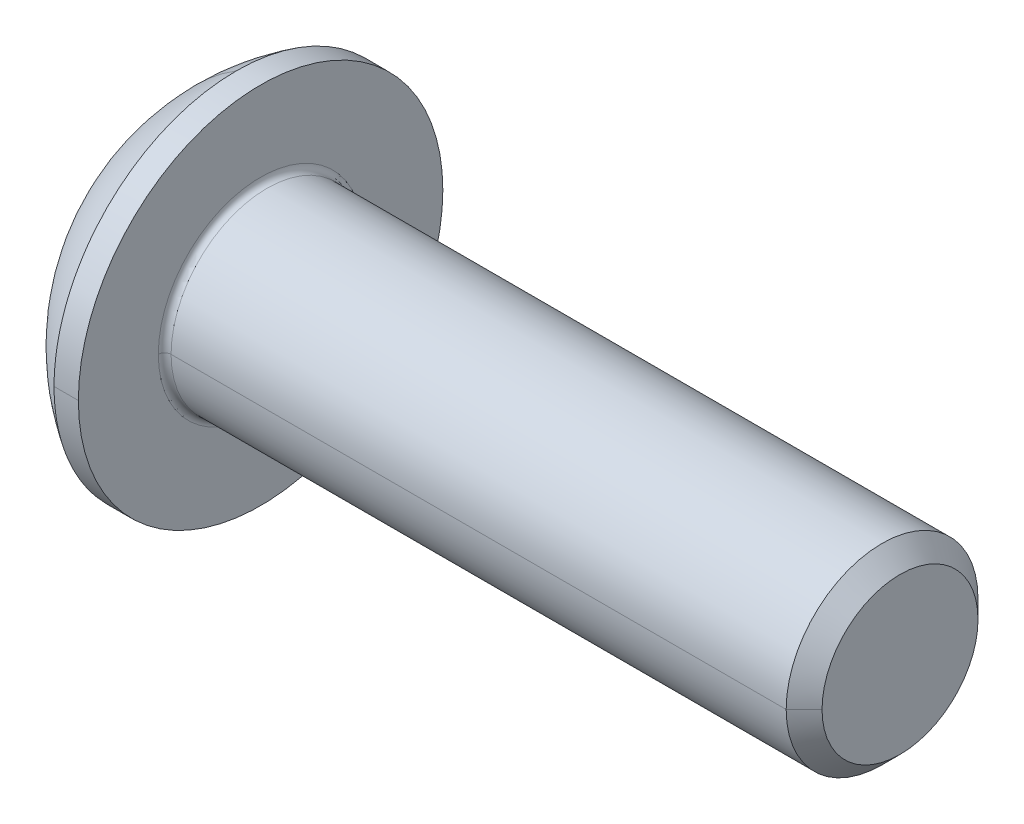
ISO-10303-21;
HEADER;
FILE_DESCRIPTION(('STEP AP214'),'2;1');
FILE_NAME('part.step','',(''),(''),'','','');
FILE_SCHEMA(('AUTOMOTIVE_DESIGN { 1 0 10303 214 1 1 1 1 }'));
ENDSEC;
DATA;
#1=APPLICATION_CONTEXT('core data for automotive mechanical design processes');
#2=APPLICATION_PROTOCOL_DEFINITION('international standard','automotive_design',2000,#1);
#3=PRODUCT_CONTEXT('',#1,'mechanical');
#4=PRODUCT('Part','Part','',(#3));
#5=PRODUCT_RELATED_PRODUCT_CATEGORY('part','',(#4));
#6=PRODUCT_DEFINITION_FORMATION('','',#4);
#7=PRODUCT_DEFINITION_CONTEXT('part definition',#1,'design');
#8=PRODUCT_DEFINITION('design','',#6,#7);
#9=PRODUCT_DEFINITION_SHAPE('','',#8);
#10=(LENGTH_UNIT() NAMED_UNIT(*) SI_UNIT(.MILLI.,.METRE.));
#11=(NAMED_UNIT(*) PLANE_ANGLE_UNIT() SI_UNIT($,.RADIAN.));
#12=(NAMED_UNIT(*) SI_UNIT($,.STERADIAN.) SOLID_ANGLE_UNIT());
#13=UNCERTAINTY_MEASURE_WITH_UNIT(LENGTH_MEASURE(1.E-05),#10,'distance_accuracy_value','');
#14=(GEOMETRIC_REPRESENTATION_CONTEXT(3) GLOBAL_UNCERTAINTY_ASSIGNED_CONTEXT((#13)) GLOBAL_UNIT_ASSIGNED_CONTEXT((#10,
#11,#12)) REPRESENTATION_CONTEXT('',''));
#15=CARTESIAN_POINT('',(0.,0.,0.));
#16=DIRECTION('',(0.,0.,1.));
#17=DIRECTION('',(1.,0.,0.));
#18=AXIS2_PLACEMENT_3D('',#15,#16,#17);
#19=CARTESIAN_POINT('',(-998.38264973081,0.,0.));
#20=DIRECTION('',(-1.,0.,0.));
#21=DIRECTION('',(0.,0.,1.));
#22=AXIS2_PLACEMENT_3D('',#19,#20,#21);
#23=CONICAL_SURFACE('',#22,1732.05080756885,1.0471975511966);
#24=DIRECTION('',(-0.5,0.,-0.866025403784436));
#25=VECTOR('',#24,1.);
#26=CARTESIAN_POINT('',(1.61735026918964,0.,0.));
#27=LINE('',#26,#25);
#28=CARTESIAN_POINT('',(1.61735026918964,0.,0.));
#29=VERTEX_POINT('',#28);
#30=CARTESIAN_POINT('',(1.04,0.,-1.));
#31=VERTEX_POINT('',#30);
#32=EDGE_CURVE('E832',#29,#31,#27,.T.);
#33=ORIENTED_EDGE('',*,*,#32,.F.);
#34=DIRECTION('',(-0.5,0.,0.866025403784436));
#35=VECTOR('',#34,1.);
#36=CARTESIAN_POINT('',(1.61735026918964,0.,0.));
#37=LINE('',#36,#35);
#38=CARTESIAN_POINT('',(1.04,0.,1.));
#39=VERTEX_POINT('',#38);
#40=EDGE_CURVE('E829',#29,#39,#37,.T.);
#41=ORIENTED_EDGE('',*,*,#40,.T.);
#42=CARTESIAN_POINT('',(1.04,0.,0.));
#43=DIRECTION('',(-1.,0.,0.));
#44=DIRECTION('',(0.,0.,1.));
#45=AXIS2_PLACEMENT_3D('',#42,#43,#44);
#46=CIRCLE('',#45,1.);
#47=CARTESIAN_POINT('',(1.04,0.86602540378444,0.5));
#48=VERTEX_POINT('',#47);
#49=EDGE_CURVE('E11',#39,#48,#46,.T.);
#50=ORIENTED_EDGE('',*,*,#49,.T.);
#51=CARTESIAN_POINT('',(1.04,0.,0.));
#52=DIRECTION('',(-1.,0.,0.));
#53=DIRECTION('',(0.,0.,1.));
#54=AXIS2_PLACEMENT_3D('',#51,#52,#53);
#55=CIRCLE('',#54,1.);
#56=CARTESIAN_POINT('',(1.04,0.86602540378444,-0.5));
#57=VERTEX_POINT('',#56);
#58=EDGE_CURVE('E20',#48,#57,#55,.T.);
#59=ORIENTED_EDGE('',*,*,#58,.T.);
#60=CARTESIAN_POINT('',(1.04,0.,0.));
#61=DIRECTION('',(-1.,0.,0.));
#62=DIRECTION('',(0.,0.,1.));
#63=AXIS2_PLACEMENT_3D('',#60,#61,#62);
#64=CIRCLE('',#63,1.);
#65=EDGE_CURVE('E186',#57,#31,#64,.T.);
#66=ORIENTED_EDGE('',*,*,#65,.T.);
#67=EDGE_LOOP('',(#33,#41,#50,#59,#66));
#68=FACE_BOUND('',#67,.T.);
#69=ADVANCED_FACE('F17',(#68),#23,.F.);
#70=CARTESIAN_POINT('',(1.04,-1.73205080756887,-1.));
#71=DIRECTION('',(1.,0.,0.));
#72=DIRECTION('',(0.,1.,0.));
#73=AXIS2_PLACEMENT_3D('',#70,#71,#72);
#74=PLANE('',#73);
#75=CARTESIAN_POINT('',(1.04,0.,0.));
#76=DIRECTION('',(-1.,0.,0.));
#77=DIRECTION('',(0.,0.,1.));
#78=AXIS2_PLACEMENT_3D('',#75,#76,#77);
#79=CIRCLE('',#78,1.);
#80=CARTESIAN_POINT('',(1.04,-0.86602540378444,-0.5));
#81=VERTEX_POINT('',#80);
#82=EDGE_CURVE('E840',#31,#81,#79,.T.);
#83=ORIENTED_EDGE('',*,*,#82,.F.);
#84=DIRECTION('',(0.,1.,0.));
#85=VECTOR('',#84,1.);
#86=CARTESIAN_POINT('',(1.04,0.577350269189628,-1.));
#87=LINE('',#86,#85);
#88=CARTESIAN_POINT('',(1.04,-0.577350269189626,-1.));
#89=VERTEX_POINT('',#88);
#90=EDGE_CURVE('E785',#89,#31,#87,.T.);
#91=ORIENTED_EDGE('',*,*,#90,.F.);
#92=DIRECTION('',(0.,0.5,-0.86602540378444));
#93=VECTOR('',#92,1.);
#94=CARTESIAN_POINT('',(1.04,-0.577350269189626,-1.));
#95=LINE('',#94,#93);
#96=EDGE_CURVE('E788',#81,#89,#95,.T.);
#97=ORIENTED_EDGE('',*,*,#96,.F.);
#98=EDGE_LOOP('',(#83,#91,#97));
#99=FACE_BOUND('',#98,.T.);
#100=ADVANCED_FACE('F441',(#99),#74,.F.);
#101=CARTESIAN_POINT('',(1.04,-1.73205080756887,-1.));
#102=DIRECTION('',(1.,0.,0.));
#103=DIRECTION('',(0.,1.,0.));
#104=AXIS2_PLACEMENT_3D('',#101,#102,#103);
#105=PLANE('',#104);
#106=CARTESIAN_POINT('',(1.04,0.,0.));
#107=DIRECTION('',(-1.,0.,0.));
#108=DIRECTION('',(0.,0.,1.));
#109=AXIS2_PLACEMENT_3D('',#106,#107,#108);
#110=CIRCLE('',#109,1.);
#111=CARTESIAN_POINT('',(1.04,-0.866025403784437,0.5));
#112=VERTEX_POINT('',#111);
#113=EDGE_CURVE('E684',#81,#112,#110,.T.);
#114=ORIENTED_EDGE('',*,*,#113,.F.);
#115=DIRECTION('',(0.,0.5,-0.86602540378444));
#116=VECTOR('',#115,1.);
#117=CARTESIAN_POINT('',(1.04,-0.577350269189626,-1.));
#118=LINE('',#117,#116);
#119=CARTESIAN_POINT('',(1.04,-1.15470053837925,0.));
#120=VERTEX_POINT('',#119);
#121=EDGE_CURVE('E793',#120,#81,#118,.T.);
#122=ORIENTED_EDGE('',*,*,#121,.F.);
#123=DIRECTION('',(0.,-0.5,-0.866025403784439));
#124=VECTOR('',#123,1.);
#125=CARTESIAN_POINT('',(1.04,-1.15470053837925,0.));
#126=LINE('',#125,#124);
#127=EDGE_CURVE('E798',#112,#120,#126,.T.);
#128=ORIENTED_EDGE('',*,*,#127,.F.);
#129=EDGE_LOOP('',(#114,#122,#128));
#130=FACE_BOUND('',#129,.T.);
#131=ADVANCED_FACE('F431',(#130),#105,.F.);
#132=CARTESIAN_POINT('',(1.04,-1.73205080756887,-1.));
#133=DIRECTION('',(1.,0.,0.));
#134=DIRECTION('',(0.,1.,0.));
#135=AXIS2_PLACEMENT_3D('',#132,#133,#134);
#136=PLANE('',#135);
#137=CARTESIAN_POINT('',(1.04,0.,0.));
#138=DIRECTION('',(-1.,0.,0.));
#139=DIRECTION('',(0.,0.,1.));
#140=AXIS2_PLACEMENT_3D('',#137,#138,#139);
#141=CIRCLE('',#140,1.);
#142=EDGE_CURVE('E676',#112,#39,#141,.T.);
#143=ORIENTED_EDGE('',*,*,#142,.F.);
#144=DIRECTION('',(0.,-0.5,-0.866025403784439));
#145=VECTOR('',#144,1.);
#146=CARTESIAN_POINT('',(1.04,-1.15470053837925,0.));
#147=LINE('',#146,#145);
#148=CARTESIAN_POINT('',(1.04,-0.577350269189625,1.));
#149=VERTEX_POINT('',#148);
#150=EDGE_CURVE('E794',#149,#112,#147,.T.);
#151=ORIENTED_EDGE('',*,*,#150,.F.);
#152=DIRECTION('',(0.,-1.,0.));
#153=VECTOR('',#152,1.);
#154=CARTESIAN_POINT('',(1.04,-0.577350269189625,1.));
#155=LINE('',#154,#153);
#156=EDGE_CURVE('E184',#39,#149,#155,.T.);
#157=ORIENTED_EDGE('',*,*,#156,.F.);
#158=EDGE_LOOP('',(#143,#151,#157));
#159=FACE_BOUND('',#158,.T.);
#160=ADVANCED_FACE('F422',(#159),#136,.F.);
#161=CARTESIAN_POINT('',(1.04,-1.73205080756887,-1.));
#162=DIRECTION('',(1.,0.,0.));
#163=DIRECTION('',(0.,1.,0.));
#164=AXIS2_PLACEMENT_3D('',#161,#162,#163);
#165=PLANE('',#164);
#166=ORIENTED_EDGE('',*,*,#49,.F.);
#167=DIRECTION('',(0.,-1.,0.));
#168=VECTOR('',#167,1.);
#169=CARTESIAN_POINT('',(1.04,-0.577350269189625,1.));
#170=LINE('',#169,#168);
#171=CARTESIAN_POINT('',(1.04,0.577350269189628,1.));
#172=VERTEX_POINT('',#171);
#173=EDGE_CURVE('E41',#172,#39,#170,.T.);
#174=ORIENTED_EDGE('',*,*,#173,.F.);
#175=DIRECTION('',(0.,-0.5,0.86602540378444));
#176=VECTOR('',#175,1.);
#177=CARTESIAN_POINT('',(1.04,0.577350269189628,1.));
#178=LINE('',#177,#176);
#179=EDGE_CURVE('E157',#48,#172,#178,.T.);
#180=ORIENTED_EDGE('',*,*,#179,.F.);
#181=EDGE_LOOP('',(#166,#174,#180));
#182=FACE_BOUND('',#181,.T.);
#183=ADVANCED_FACE('F413',(#182),#165,.F.);
#184=CARTESIAN_POINT('',(1.04,-1.73205080756887,-1.));
#185=DIRECTION('',(1.,0.,0.));
#186=DIRECTION('',(0.,1.,0.));
#187=AXIS2_PLACEMENT_3D('',#184,#185,#186);
#188=PLANE('',#187);
#189=ORIENTED_EDGE('',*,*,#58,.F.);
#190=DIRECTION('',(0.,-0.5,0.86602540378444));
#191=VECTOR('',#190,1.);
#192=CARTESIAN_POINT('',(1.04,0.577350269189628,1.));
#193=LINE('',#192,#191);
#194=CARTESIAN_POINT('',(1.04,1.15470053837925,0.));
#195=VERTEX_POINT('',#194);
#196=EDGE_CURVE('E148',#195,#48,#193,.T.);
#197=ORIENTED_EDGE('',*,*,#196,.F.);
#198=DIRECTION('',(0.,0.5,0.86602540378444));
#199=VECTOR('',#198,1.);
#200=CARTESIAN_POINT('',(1.04,1.15470053837925,0.));
#201=LINE('',#200,#199);
#202=EDGE_CURVE('E152',#57,#195,#201,.T.);
#203=ORIENTED_EDGE('',*,*,#202,.F.);
#204=EDGE_LOOP('',(#189,#197,#203));
#205=FACE_BOUND('',#204,.T.);
#206=ADVANCED_FACE('F150',(#205),#188,.F.);
#207=CARTESIAN_POINT('',(1.04,-1.73205080756887,-1.));
#208=DIRECTION('',(1.,0.,0.));
#209=DIRECTION('',(0.,1.,0.));
#210=AXIS2_PLACEMENT_3D('',#207,#208,#209);
#211=PLANE('',#210);
#212=ORIENTED_EDGE('',*,*,#65,.F.);
#213=DIRECTION('',(0.,0.5,0.86602540378444));
#214=VECTOR('',#213,1.);
#215=CARTESIAN_POINT('',(1.04,1.15470053837925,0.));
#216=LINE('',#215,#214);
#217=CARTESIAN_POINT('',(1.04,0.577350269189628,-1.));
#218=VERTEX_POINT('',#217);
#219=EDGE_CURVE('E171',#218,#57,#216,.T.);
#220=ORIENTED_EDGE('',*,*,#219,.F.);
#221=DIRECTION('',(0.,1.,0.));
#222=VECTOR('',#221,1.);
#223=CARTESIAN_POINT('',(1.04,0.577350269189628,-1.));
#224=LINE('',#223,#222);
#225=EDGE_CURVE('E781',#31,#218,#224,.T.);
#226=ORIENTED_EDGE('',*,*,#225,.F.);
#227=EDGE_LOOP('',(#212,#220,#226));
#228=FACE_BOUND('',#227,.T.);
#229=ADVANCED_FACE('F267',(#228),#211,.F.);
#230=CARTESIAN_POINT('',(1.04,-0.577350269189625,1.));
#231=DIRECTION('',(0.,0.,-1.));
#232=DIRECTION('',(-1.,0.,0.));
#233=AXIS2_PLACEMENT_3D('',#230,#231,#232);
#234=PLANE('',#233);
#235=ORIENTED_EDGE('',*,*,#173,.T.);
#236=ORIENTED_EDGE('',*,*,#156,.T.);
#237=DIRECTION('',(-1.,0.,0.));
#238=VECTOR('',#237,1.);
#239=CARTESIAN_POINT('',(1.04,-0.577350269189625,1.));
#240=LINE('',#239,#238);
#241=CARTESIAN_POINT('',(0.,-0.577350269189625,1.));
#242=VERTEX_POINT('',#241);
#243=EDGE_CURVE('E807',#149,#242,#240,.T.);
#244=ORIENTED_EDGE('',*,*,#243,.T.);
#245=DIRECTION('',(0.,-1.,0.));
#246=VECTOR('',#245,1.);
#247=CARTESIAN_POINT('',(0.,-0.577350269189625,1.));
#248=LINE('',#247,#246);
#249=CARTESIAN_POINT('',(0.,0.577350269189628,1.));
#250=VERTEX_POINT('',#249);
#251=EDGE_CURVE('E759',#250,#242,#248,.T.);
#252=ORIENTED_EDGE('',*,*,#251,.F.);
#253=DIRECTION('',(-1.,0.,0.));
#254=VECTOR('',#253,1.);
#255=CARTESIAN_POINT('',(1.04,0.577350269189628,1.));
#256=LINE('',#255,#254);
#257=EDGE_CURVE('E181',#172,#250,#256,.T.);
#258=ORIENTED_EDGE('',*,*,#257,.F.);
#259=EDGE_LOOP('',(#235,#236,#244,#252,#258));
#260=FACE_BOUND('',#259,.T.);
#261=ADVANCED_FACE('F206',(#260),#234,.T.);
#262=CARTESIAN_POINT('',(1.04,0.577350269189628,1.));
#263=DIRECTION('',(0.,-0.86602540378444,-0.5));
#264=DIRECTION('',(0.,0.5,-0.86602540378444));
#265=AXIS2_PLACEMENT_3D('',#262,#263,#264);
#266=PLANE('',#265);
#267=ORIENTED_EDGE('',*,*,#196,.T.);
#268=ORIENTED_EDGE('',*,*,#179,.T.);
#269=ORIENTED_EDGE('',*,*,#257,.T.);
#270=DIRECTION('',(0.,-0.5,0.86602540378444));
#271=VECTOR('',#270,1.);
#272=CARTESIAN_POINT('',(0.,0.577350269189628,1.));
#273=LINE('',#272,#271);
#274=CARTESIAN_POINT('',(0.,1.15470053837925,0.));
#275=VERTEX_POINT('',#274);
#276=EDGE_CURVE('E163',#275,#250,#273,.T.);
#277=ORIENTED_EDGE('',*,*,#276,.F.);
#278=DIRECTION('',(-1.,0.,0.));
#279=VECTOR('',#278,1.);
#280=CARTESIAN_POINT('',(1.04,1.15470053837925,0.));
#281=LINE('',#280,#279);
#282=EDGE_CURVE('E158',#195,#275,#281,.T.);
#283=ORIENTED_EDGE('',*,*,#282,.F.);
#284=EDGE_LOOP('',(#267,#268,#269,#277,#283));
#285=FACE_BOUND('',#284,.T.);
#286=ADVANCED_FACE('F161',(#285),#266,.T.);
#287=CARTESIAN_POINT('',(1.04,1.15470053837925,0.));
#288=DIRECTION('',(0.,-0.86602540378444,0.5));
#289=DIRECTION('',(-1.,0.,0.));
#290=AXIS2_PLACEMENT_3D('',#287,#288,#289);
#291=PLANE('',#290);
#292=ORIENTED_EDGE('',*,*,#219,.T.);
#293=ORIENTED_EDGE('',*,*,#202,.T.);
#294=ORIENTED_EDGE('',*,*,#282,.T.);
#295=DIRECTION('',(0.,0.5,0.86602540378444));
#296=VECTOR('',#295,1.);
#297=CARTESIAN_POINT('',(0.,1.15470053837925,0.));
#298=LINE('',#297,#296);
#299=CARTESIAN_POINT('',(0.,0.577350269189628,-1.));
#300=VERTEX_POINT('',#299);
#301=EDGE_CURVE('E692',#300,#275,#298,.T.);
#302=ORIENTED_EDGE('',*,*,#301,.F.);
#303=DIRECTION('',(-1.,0.,0.));
#304=VECTOR('',#303,1.);
#305=CARTESIAN_POINT('',(1.04,0.577350269189628,-1.));
#306=LINE('',#305,#304);
#307=EDGE_CURVE('E177',#218,#300,#306,.T.);
#308=ORIENTED_EDGE('',*,*,#307,.F.);
#309=EDGE_LOOP('',(#292,#293,#294,#302,#308));
#310=FACE_BOUND('',#309,.T.);
#311=ADVANCED_FACE('F169',(#310),#291,.T.);
#312=CARTESIAN_POINT('',(1.04,0.577350269189628,-1.));
#313=DIRECTION('',(0.,0.,1.));
#314=DIRECTION('',(1.,0.,0.));
#315=AXIS2_PLACEMENT_3D('',#312,#313,#314);
#316=PLANE('',#315);
#317=ORIENTED_EDGE('',*,*,#90,.T.);
#318=ORIENTED_EDGE('',*,*,#225,.T.);
#319=ORIENTED_EDGE('',*,*,#307,.T.);
#320=DIRECTION('',(0.,1.,0.));
#321=VECTOR('',#320,1.);
#322=CARTESIAN_POINT('',(0.,0.577350269189628,-1.));
#323=LINE('',#322,#321);
#324=CARTESIAN_POINT('',(0.,-0.577350269189626,-1.));
#325=VERTEX_POINT('',#324);
#326=EDGE_CURVE('E773',#325,#300,#323,.T.);
#327=ORIENTED_EDGE('',*,*,#326,.F.);
#328=DIRECTION('',(-1.,0.,0.));
#329=VECTOR('',#328,1.);
#330=CARTESIAN_POINT('',(1.04,-0.577350269189626,-1.));
#331=LINE('',#330,#329);
#332=EDGE_CURVE('E792',#89,#325,#331,.T.);
#333=ORIENTED_EDGE('',*,*,#332,.F.);
#334=EDGE_LOOP('',(#317,#318,#319,#327,#333));
#335=FACE_BOUND('',#334,.T.);
#336=ADVANCED_FACE('F350',(#335),#316,.T.);
#337=CARTESIAN_POINT('',(1.04,-0.577350269189626,-1.));
#338=DIRECTION('',(0.,0.86602540378444,0.5));
#339=DIRECTION('',(1.,0.,0.));
#340=AXIS2_PLACEMENT_3D('',#337,#338,#339);
#341=PLANE('',#340);
#342=ORIENTED_EDGE('',*,*,#121,.T.);
#343=ORIENTED_EDGE('',*,*,#96,.T.);
#344=ORIENTED_EDGE('',*,*,#332,.T.);
#345=DIRECTION('',(0.,0.5,-0.86602540378444));
#346=VECTOR('',#345,1.);
#347=CARTESIAN_POINT('',(0.,-0.577350269189626,-1.));
#348=LINE('',#347,#346);
#349=CARTESIAN_POINT('',(0.,-1.15470053837925,0.));
#350=VERTEX_POINT('',#349);
#351=EDGE_CURVE('E769',#350,#325,#348,.T.);
#352=ORIENTED_EDGE('',*,*,#351,.F.);
#353=DIRECTION('',(-1.,0.,0.));
#354=VECTOR('',#353,1.);
#355=CARTESIAN_POINT('',(1.04,-1.15470053837925,0.));
#356=LINE('',#355,#354);
#357=EDGE_CURVE('E802',#120,#350,#356,.T.);
#358=ORIENTED_EDGE('',*,*,#357,.F.);
#359=EDGE_LOOP('',(#342,#343,#344,#352,#358));
#360=FACE_BOUND('',#359,.T.);
#361=ADVANCED_FACE('F291',(#360),#341,.T.);
#362=CARTESIAN_POINT('',(1.04,-1.15470053837925,0.));
#363=DIRECTION('',(0.,0.866025403784439,-0.5));
#364=DIRECTION('',(-1.,0.,0.));
#365=AXIS2_PLACEMENT_3D('',#362,#363,#364);
#366=PLANE('',#365);
#367=ORIENTED_EDGE('',*,*,#150,.T.);
#368=ORIENTED_EDGE('',*,*,#127,.T.);
#369=ORIENTED_EDGE('',*,*,#357,.T.);
#370=DIRECTION('',(0.,-0.5,-0.866025403784439));
#371=VECTOR('',#370,1.);
#372=CARTESIAN_POINT('',(0.,-1.15470053837925,0.));
#373=LINE('',#372,#371);
#374=EDGE_CURVE('E765',#242,#350,#373,.T.);
#375=ORIENTED_EDGE('',*,*,#374,.F.);
#376=ORIENTED_EDGE('',*,*,#243,.F.);
#377=EDGE_LOOP('',(#367,#368,#369,#375,#376));
#378=FACE_BOUND('',#377,.T.);
#379=ADVANCED_FACE('F286',(#378),#366,.T.);
#380=CARTESIAN_POINT('',(1.75,0.,0.));
#381=DIRECTION('',(-1.,0.,0.));
#382=DIRECTION('',(0.,0.,1.));
#383=AXIS2_PLACEMENT_3D('',#380,#381,#382);
#384=TOROIDAL_SURFACE('',#383,1.6,0.1);
#385=CARTESIAN_POINT('',(1.75,0.,-1.6));
#386=DIRECTION('',(0.,1.,0.));
#387=DIRECTION('',(0.,0.,1.));
#388=AXIS2_PLACEMENT_3D('',#385,#386,#387);
#389=CIRCLE('',#388,0.1);
#390=CARTESIAN_POINT('',(1.65,0.,-1.6));
#391=VERTEX_POINT('',#390);
#392=CARTESIAN_POINT('',(1.75,0.,-1.5));
#393=VERTEX_POINT('',#392);
#394=EDGE_CURVE('E666',#391,#393,#389,.T.);
#395=ORIENTED_EDGE('',*,*,#394,.F.);
#396=CARTESIAN_POINT('',(1.65,0.,0.));
#397=DIRECTION('',(-1.,0.,0.));
#398=DIRECTION('',(0.,0.,1.));
#399=AXIS2_PLACEMENT_3D('',#396,#397,#398);
#400=CIRCLE('',#399,1.6);
#401=CARTESIAN_POINT('',(1.65,0.,1.6));
#402=VERTEX_POINT('',#401);
#403=EDGE_CURVE('E654',#402,#391,#400,.T.);
#404=ORIENTED_EDGE('',*,*,#403,.F.);
#405=CARTESIAN_POINT('',(1.75,0.,1.6));
#406=DIRECTION('',(0.,-1.,0.));
#407=DIRECTION('',(0.,0.,-1.));
#408=AXIS2_PLACEMENT_3D('',#405,#406,#407);
#409=CIRCLE('',#408,0.1);
#410=CARTESIAN_POINT('',(1.75,0.,1.5));
#411=VERTEX_POINT('',#410);
#412=EDGE_CURVE('E674',#402,#411,#409,.T.);
#413=ORIENTED_EDGE('',*,*,#412,.T.);
#414=CARTESIAN_POINT('',(1.75,0.,0.));
#415=DIRECTION('',(1.,0.,0.));
#416=DIRECTION('',(0.,0.,1.));
#417=AXIS2_PLACEMENT_3D('',#414,#415,#416);
#418=CIRCLE('',#417,1.5);
#419=EDGE_CURVE('E668',#393,#411,#418,.T.);
#420=ORIENTED_EDGE('',*,*,#419,.F.);
#421=EDGE_LOOP('',(#395,#404,#413,#420));
#422=FACE_BOUND('',#421,.T.);
#423=ADVANCED_FACE('F290',(#422),#384,.F.);
#424=CARTESIAN_POINT('',(11.65,0.,0.));
#425=DIRECTION('',(-1.,0.,0.));
#426=DIRECTION('',(0.,0.,1.));
#427=AXIS2_PLACEMENT_3D('',#424,#425,#426);
#428=PLANE('',#427);
#429=CARTESIAN_POINT('',(11.65,0.,0.));
#430=DIRECTION('',(-1.,0.,0.));
#431=DIRECTION('',(0.,0.,1.));
#432=AXIS2_PLACEMENT_3D('',#429,#430,#431);
#433=CIRCLE('',#432,1.2195);
#434=CARTESIAN_POINT('',(11.65,0.,1.2195));
#435=VERTEX_POINT('',#434);
#436=CARTESIAN_POINT('',(11.65,0.,-1.2195));
#437=VERTEX_POINT('',#436);
#438=EDGE_CURVE('E718',#435,#437,#433,.T.);
#439=ORIENTED_EDGE('',*,*,#438,.F.);
#440=CARTESIAN_POINT('',(11.65,0.,0.));
#441=DIRECTION('',(-1.,0.,0.));
#442=DIRECTION('',(0.,0.,1.));
#443=AXIS2_PLACEMENT_3D('',#440,#441,#442);
#444=CIRCLE('',#443,1.2195);
#445=EDGE_CURVE('E688',#437,#435,#444,.T.);
#446=ORIENTED_EDGE('',*,*,#445,.F.);
#447=EDGE_LOOP('',(#439,#446));
#448=FACE_BOUND('',#447,.T.);
#449=ADVANCED_FACE('F260',(#448),#428,.F.);
#450=CARTESIAN_POINT('',(11.65,0.,0.));
#451=DIRECTION('',(-1.,0.,0.));
#452=DIRECTION('',(0.,0.,1.));
#453=AXIS2_PLACEMENT_3D('',#450,#451,#452);
#454=CONICAL_SURFACE('',#453,1.2195,0.785398163397455);
#455=DIRECTION('',(-0.707106781186543,0.,-0.707106781186552));
#456=VECTOR('',#455,1.);
#457=CARTESIAN_POINT('',(11.65,0.,-1.2195));
#458=LINE('',#457,#456);
#459=CARTESIAN_POINT('',(11.3695,0.,-1.5));
#460=VERTEX_POINT('',#459);
#461=EDGE_CURVE('E714',#437,#460,#458,.T.);
#462=ORIENTED_EDGE('',*,*,#461,.F.);
#463=ORIENTED_EDGE('',*,*,#445,.T.);
#464=DIRECTION('',(-0.707106781186543,0.,0.707106781186552));
#465=VECTOR('',#464,1.);
#466=CARTESIAN_POINT('',(11.65,0.,1.2195));
#467=LINE('',#466,#465);
#468=CARTESIAN_POINT('',(11.3695,0.,1.5));
#469=VERTEX_POINT('',#468);
#470=EDGE_CURVE('E695',#435,#469,#467,.T.);
#471=ORIENTED_EDGE('',*,*,#470,.T.);
#472=CARTESIAN_POINT('',(11.3695,0.,0.));
#473=DIRECTION('',(-1.,0.,0.));
#474=DIRECTION('',(0.,0.,1.));
#475=AXIS2_PLACEMENT_3D('',#472,#473,#474);
#476=CIRCLE('',#475,1.5);
#477=EDGE_CURVE('E662',#460,#469,#476,.T.);
#478=ORIENTED_EDGE('',*,*,#477,.F.);
#479=EDGE_LOOP('',(#462,#463,#471,#478));
#480=FACE_BOUND('',#479,.T.);
#481=ADVANCED_FACE('F255',(#480),#454,.T.);
#482=CARTESIAN_POINT('',(0.,0.,0.));
#483=DIRECTION('',(-1.,0.,0.));
#484=DIRECTION('',(0.,0.,1.));
#485=AXIS2_PLACEMENT_3D('',#482,#483,#484);
#486=CYLINDRICAL_SURFACE('',#485,1.5);
#487=DIRECTION('',(-1.,0.,0.));
#488=VECTOR('',#487,1.);
#489=CARTESIAN_POINT('',(0.,0.,-1.5));
#490=LINE('',#489,#488);
#491=EDGE_CURVE('E693',#460,#393,#490,.T.);
#492=ORIENTED_EDGE('',*,*,#491,.F.);
#493=ORIENTED_EDGE('',*,*,#477,.T.);
#494=DIRECTION('',(-1.,0.,0.));
#495=VECTOR('',#494,1.);
#496=CARTESIAN_POINT('',(0.,0.,1.5));
#497=LINE('',#496,#495);
#498=EDGE_CURVE('E706',#469,#411,#497,.T.);
#499=ORIENTED_EDGE('',*,*,#498,.T.);
#500=CARTESIAN_POINT('',(1.75,0.,0.));
#501=DIRECTION('',(1.,0.,0.));
#502=DIRECTION('',(0.,0.,1.));
#503=AXIS2_PLACEMENT_3D('',#500,#501,#502);
#504=CIRCLE('',#503,1.5);
#505=EDGE_CURVE('E672',#411,#393,#504,.T.);
#506=ORIENTED_EDGE('',*,*,#505,.T.);
#507=EDGE_LOOP('',(#492,#493,#499,#506));
#508=FACE_BOUND('',#507,.T.);
#509=ADVANCED_FACE('F259',(#508),#486,.T.);
#510=CARTESIAN_POINT('',(1.65,1.5,0.));
#511=DIRECTION('',(-1.,0.,0.));
#512=DIRECTION('',(0.,0.,1.));
#513=AXIS2_PLACEMENT_3D('',#510,#511,#512);
#514=PLANE('',#513);
#515=ORIENTED_EDGE('',*,*,#403,.T.);
#516=CARTESIAN_POINT('',(1.65,0.,0.));
#517=DIRECTION('',(-1.,0.,0.));
#518=DIRECTION('',(0.,0.,1.));
#519=AXIS2_PLACEMENT_3D('',#516,#517,#518);
#520=CIRCLE('',#519,1.6);
#521=EDGE_CURVE('E658',#391,#402,#520,.T.);
#522=ORIENTED_EDGE('',*,*,#521,.T.);
#523=EDGE_LOOP('',(#515,#522));
#524=FACE_BOUND('',#523,.T.);
#525=CARTESIAN_POINT('',(1.65,0.,0.));
#526=DIRECTION('',(-1.,0.,0.));
#527=DIRECTION('',(0.,0.,1.));
#528=AXIS2_PLACEMENT_3D('',#525,#526,#527);
#529=CIRCLE('',#528,2.85);
#530=CARTESIAN_POINT('',(1.65,0.,2.85));
#531=VERTEX_POINT('',#530);
#532=CARTESIAN_POINT('',(1.65,0.,-2.85));
#533=VERTEX_POINT('',#532);
#534=EDGE_CURVE('E709',#531,#533,#529,.T.);
#535=ORIENTED_EDGE('',*,*,#534,.F.);
#536=CARTESIAN_POINT('',(1.65,0.,0.));
#537=DIRECTION('',(-1.,0.,0.));
#538=DIRECTION('',(0.,0.,1.));
#539=AXIS2_PLACEMENT_3D('',#536,#537,#538);
#540=CIRCLE('',#539,2.85);
#541=EDGE_CURVE('E663',#533,#531,#540,.T.);
#542=ORIENTED_EDGE('',*,*,#541,.F.);
#543=EDGE_LOOP('',(#535,#542));
#544=FACE_BOUND('',#543,.T.);
#545=ADVANCED_FACE('F311',(#524,#544),#514,.F.);
#546=CARTESIAN_POINT('',(0.,0.,0.));
#547=DIRECTION('',(-1.,0.,0.));
#548=DIRECTION('',(0.,0.,1.));
#549=AXIS2_PLACEMENT_3D('',#546,#547,#548);
#550=CYLINDRICAL_SURFACE('',#549,2.85);
#551=DIRECTION('',(-1.,0.,0.));
#552=VECTOR('',#551,1.);
#553=CARTESIAN_POINT('',(0.,0.,-2.85));
#554=LINE('',#553,#552);
#555=CARTESIAN_POINT('',(1.27,0.,-2.85));
#556=VERTEX_POINT('',#555);
#557=EDGE_CURVE('E730',#533,#556,#554,.T.);
#558=ORIENTED_EDGE('',*,*,#557,.F.);
#559=ORIENTED_EDGE('',*,*,#541,.T.);
#560=DIRECTION('',(-1.,0.,0.));
#561=VECTOR('',#560,1.);
#562=CARTESIAN_POINT('',(0.,0.,2.85));
#563=LINE('',#562,#561);
#564=CARTESIAN_POINT('',(1.27,0.,2.85));
#565=VERTEX_POINT('',#564);
#566=EDGE_CURVE('E742',#531,#565,#563,.T.);
#567=ORIENTED_EDGE('',*,*,#566,.T.);
#568=CARTESIAN_POINT('',(1.27,0.,0.));
#569=DIRECTION('',(-1.,0.,0.));
#570=DIRECTION('',(0.,0.,1.));
#571=AXIS2_PLACEMENT_3D('',#568,#569,#570);
#572=CIRCLE('',#571,2.85);
#573=CARTESIAN_POINT('',(1.27,-2.85,0.));
#574=VERTEX_POINT('',#573);
#575=EDGE_CURVE('E691',#574,#565,#572,.T.);
#576=ORIENTED_EDGE('',*,*,#575,.F.);
#577=CARTESIAN_POINT('',(1.27,0.,0.));
#578=DIRECTION('',(-1.,0.,0.));
#579=DIRECTION('',(0.,0.,1.));
#580=AXIS2_PLACEMENT_3D('',#577,#578,#579);
#581=CIRCLE('',#580,2.85);
#582=EDGE_CURVE('E745',#556,#574,#581,.T.);
#583=ORIENTED_EDGE('',*,*,#582,.F.);
#584=EDGE_LOOP('',(#558,#559,#567,#576,#583));
#585=FACE_BOUND('',#584,.T.);
#586=ADVANCED_FACE('F328',(#585),#550,.T.);
#587=CARTESIAN_POINT('',(3.03337598425197,0.,0.));
#588=DIRECTION('',(0.,0.,-1.));
#589=DIRECTION('',(0.,1.,0.));
#590=AXIS2_PLACEMENT_3D('',#587,#588,#589);
#591=SPHERICAL_SURFACE('',#590,3.35141684393879);
#592=CARTESIAN_POINT('',(3.03337598425197,0.,0.));
#593=DIRECTION('',(0.,0.,-1.));
#594=DIRECTION('',(0.,1.,0.));
#595=AXIS2_PLACEMENT_3D('',#592,#593,#594);
#596=CIRCLE('',#595,3.35141684393879);
#597=CARTESIAN_POINT('',(0.,-1.425,0.));
#598=VERTEX_POINT('',#597);
#599=EDGE_CURVE('E750',#574,#598,#596,.T.);
#600=ORIENTED_EDGE('',*,*,#599,.F.);
#601=ORIENTED_EDGE('',*,*,#575,.T.);
#602=CARTESIAN_POINT('',(1.27,0.,0.));
#603=DIRECTION('',(-1.,0.,0.));
#604=DIRECTION('',(0.,0.,1.));
#605=AXIS2_PLACEMENT_3D('',#602,#603,#604);
#606=CIRCLE('',#605,2.85);
#607=CARTESIAN_POINT('',(1.27,2.85,0.));
#608=VERTEX_POINT('',#607);
#609=EDGE_CURVE('E738',#565,#608,#606,.T.);
#610=ORIENTED_EDGE('',*,*,#609,.T.);
#611=CARTESIAN_POINT('',(3.03337598425197,0.,0.));
#612=DIRECTION('',(0.,0.,1.));
#613=DIRECTION('',(1.,0.,0.));
#614=AXIS2_PLACEMENT_3D('',#611,#612,#613);
#615=CIRCLE('',#614,3.35141684393879);
#616=CARTESIAN_POINT('',(0.,1.425,0.));
#617=VERTEX_POINT('',#616);
#618=EDGE_CURVE('E697',#608,#617,#615,.T.);
#619=ORIENTED_EDGE('',*,*,#618,.T.);
#620=CARTESIAN_POINT('',(0.,0.,0.));
#621=DIRECTION('',(-1.,0.,0.));
#622=DIRECTION('',(0.,0.,1.));
#623=AXIS2_PLACEMENT_3D('',#620,#621,#622);
#624=CIRCLE('',#623,1.425);
#625=EDGE_CURVE('E701',#598,#617,#624,.T.);
#626=ORIENTED_EDGE('',*,*,#625,.F.);
#627=EDGE_LOOP('',(#600,#601,#610,#619,#626));
#628=FACE_BOUND('',#627,.T.);
#629=ADVANCED_FACE('F321',(#628),#591,.T.);
#630=CARTESIAN_POINT('',(0.,0.,0.));
#631=DIRECTION('',(-1.,0.,0.));
#632=DIRECTION('',(0.,0.,1.));
#633=AXIS2_PLACEMENT_3D('',#630,#631,#632);
#634=PLANE('',#633);
#635=ORIENTED_EDGE('',*,*,#251,.T.);
#636=ORIENTED_EDGE('',*,*,#374,.T.);
#637=ORIENTED_EDGE('',*,*,#351,.T.);
#638=ORIENTED_EDGE('',*,*,#326,.T.);
#639=ORIENTED_EDGE('',*,*,#301,.T.);
#640=ORIENTED_EDGE('',*,*,#276,.T.);
#641=EDGE_LOOP('',(#635,#636,#637,#638,#639,#640));
#642=FACE_BOUND('',#641,.T.);
#643=CARTESIAN_POINT('',(0.,0.,0.));
#644=DIRECTION('',(-1.,0.,0.));
#645=DIRECTION('',(0.,0.,1.));
#646=AXIS2_PLACEMENT_3D('',#643,#644,#645);
#647=CIRCLE('',#646,1.425);
#648=EDGE_CURVE('E702',#617,#598,#647,.T.);
#649=ORIENTED_EDGE('',*,*,#648,.T.);
#650=ORIENTED_EDGE('',*,*,#625,.T.);
#651=EDGE_LOOP('',(#649,#650));
#652=FACE_BOUND('',#651,.T.);
#653=ADVANCED_FACE('F301',(#642,#652),#634,.T.);
#654=CARTESIAN_POINT('',(3.03337598425197,0.,0.));
#655=DIRECTION('',(0.,0.,-1.));
#656=DIRECTION('',(0.,1.,0.));
#657=AXIS2_PLACEMENT_3D('',#654,#655,#656);
#658=SPHERICAL_SURFACE('',#657,3.35141684393879);
#659=CARTESIAN_POINT('',(1.27,0.,0.));
#660=DIRECTION('',(-1.,0.,0.));
#661=DIRECTION('',(0.,0.,1.));
#662=AXIS2_PLACEMENT_3D('',#659,#660,#661);
#663=CIRCLE('',#662,2.85);
#664=EDGE_CURVE('E734',#608,#556,#663,.T.);
#665=ORIENTED_EDGE('',*,*,#664,.T.);
#666=ORIENTED_EDGE('',*,*,#582,.T.);
#667=ORIENTED_EDGE('',*,*,#599,.T.);
#668=ORIENTED_EDGE('',*,*,#648,.F.);
#669=ORIENTED_EDGE('',*,*,#618,.F.);
#670=EDGE_LOOP('',(#665,#666,#667,#668,#669));
#671=FACE_BOUND('',#670,.T.);
#672=ADVANCED_FACE('F229',(#671),#658,.T.);
#673=CARTESIAN_POINT('',(0.,0.,0.));
#674=DIRECTION('',(-1.,0.,0.));
#675=DIRECTION('',(0.,0.,1.));
#676=AXIS2_PLACEMENT_3D('',#673,#674,#675);
#677=CYLINDRICAL_SURFACE('',#676,2.85);
#678=ORIENTED_EDGE('',*,*,#534,.T.);
#679=ORIENTED_EDGE('',*,*,#557,.T.);
#680=ORIENTED_EDGE('',*,*,#664,.F.);
#681=ORIENTED_EDGE('',*,*,#609,.F.);
#682=ORIENTED_EDGE('',*,*,#566,.F.);
#683=EDGE_LOOP('',(#678,#679,#680,#681,#682));
#684=FACE_BOUND('',#683,.T.);
#685=ADVANCED_FACE('F224',(#684),#677,.T.);
#686=CARTESIAN_POINT('',(0.,0.,0.));
#687=DIRECTION('',(-1.,0.,0.));
#688=DIRECTION('',(0.,0.,1.));
#689=AXIS2_PLACEMENT_3D('',#686,#687,#688);
#690=CYLINDRICAL_SURFACE('',#689,1.5);
#691=CARTESIAN_POINT('',(11.3695,0.,0.));
#692=DIRECTION('',(-1.,0.,0.));
#693=DIRECTION('',(0.,0.,1.));
#694=AXIS2_PLACEMENT_3D('',#691,#692,#693);
#695=CIRCLE('',#694,1.5);
#696=EDGE_CURVE('E710',#469,#460,#695,.T.);
#697=ORIENTED_EDGE('',*,*,#696,.T.);
#698=ORIENTED_EDGE('',*,*,#491,.T.);
#699=ORIENTED_EDGE('',*,*,#419,.T.);
#700=ORIENTED_EDGE('',*,*,#498,.F.);
#701=EDGE_LOOP('',(#697,#698,#699,#700));
#702=FACE_BOUND('',#701,.T.);
#703=ADVANCED_FACE('F228',(#702),#690,.T.);
#704=CARTESIAN_POINT('',(11.65,0.,0.));
#705=DIRECTION('',(-1.,0.,0.));
#706=DIRECTION('',(0.,0.,1.));
#707=AXIS2_PLACEMENT_3D('',#704,#705,#706);
#708=CONICAL_SURFACE('',#707,1.2195,0.785398163397455);
#709=ORIENTED_EDGE('',*,*,#438,.T.);
#710=ORIENTED_EDGE('',*,*,#461,.T.);
#711=ORIENTED_EDGE('',*,*,#696,.F.);
#712=ORIENTED_EDGE('',*,*,#470,.F.);
#713=EDGE_LOOP('',(#709,#710,#711,#712));
#714=FACE_BOUND('',#713,.T.);
#715=ADVANCED_FACE('F239',(#714),#708,.T.);
#716=CARTESIAN_POINT('',(1.75,0.,0.));
#717=DIRECTION('',(-1.,0.,0.));
#718=DIRECTION('',(0.,0.,1.));
#719=AXIS2_PLACEMENT_3D('',#716,#717,#718);
#720=TOROIDAL_SURFACE('',#719,1.6,0.1);
#721=ORIENTED_EDGE('',*,*,#521,.F.);
#722=ORIENTED_EDGE('',*,*,#394,.T.);
#723=ORIENTED_EDGE('',*,*,#505,.F.);
#724=ORIENTED_EDGE('',*,*,#412,.F.);
#725=EDGE_LOOP('',(#721,#722,#723,#724));
#726=FACE_BOUND('',#725,.T.);
#727=ADVANCED_FACE('F217',(#726),#720,.F.);
#728=CARTESIAN_POINT('',(-998.38264973081,0.,0.));
#729=DIRECTION('',(-1.,0.,0.));
#730=DIRECTION('',(0.,0.,1.));
#731=AXIS2_PLACEMENT_3D('',#728,#729,#730);
#732=CONICAL_SURFACE('',#731,1732.05080756885,1.0471975511966);
#733=ORIENTED_EDGE('',*,*,#40,.F.);
#734=ORIENTED_EDGE('',*,*,#32,.T.);
#735=ORIENTED_EDGE('',*,*,#82,.T.);
#736=ORIENTED_EDGE('',*,*,#113,.T.);
#737=ORIENTED_EDGE('',*,*,#142,.T.);
#738=EDGE_LOOP('',(#733,#734,#735,#736,#737));
#739=FACE_BOUND('',#738,.T.);
#740=ADVANCED_FACE('F213',(#739),#732,.F.);
#741=CLOSED_SHELL('',(#69,#100,#131,#160,#183,#206,#229,#261,#286,#311,#336,#361,#379,#423,#449,
#481,#509,#545,#586,#629,#653,#672,#685,#703,#715,#727,#740));
#742=MANIFOLD_SOLID_BREP('B1',#741);
#743=ADVANCED_BREP_SHAPE_REPRESENTATION('',(#18,#742),#14);
#744=SHAPE_DEFINITION_REPRESENTATION(#9,#743);
ENDSEC;
END-ISO-10303-21;
